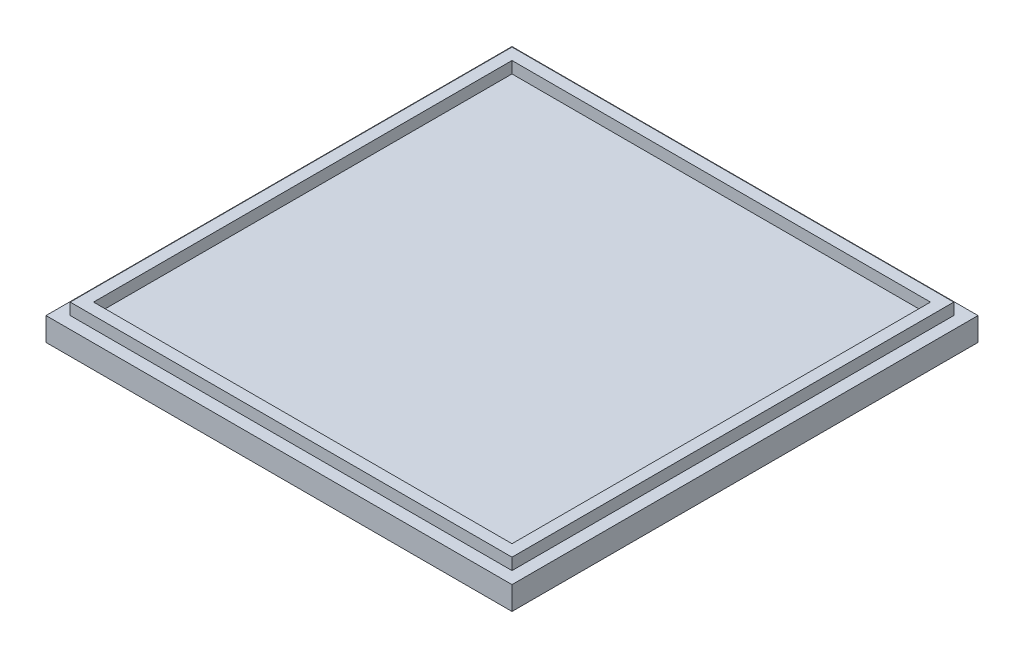
ISO-10303-21;
HEADER;
FILE_DESCRIPTION(('STEP AP214'),'2;1');
FILE_NAME('part.step','',(''),(''),'','','');
FILE_SCHEMA(('AUTOMOTIVE_DESIGN { 1 0 10303 214 1 1 1 1 }'));
ENDSEC;
DATA;
#1=APPLICATION_CONTEXT('core data for automotive mechanical design processes');
#2=APPLICATION_PROTOCOL_DEFINITION('international standard','automotive_design',2000,#1);
#3=PRODUCT_CONTEXT('',#1,'mechanical');
#4=PRODUCT('Part','Part','',(#3));
#5=PRODUCT_RELATED_PRODUCT_CATEGORY('part','',(#4));
#6=PRODUCT_DEFINITION_FORMATION('','',#4);
#7=PRODUCT_DEFINITION_CONTEXT('part definition',#1,'design');
#8=PRODUCT_DEFINITION('design','',#6,#7);
#9=PRODUCT_DEFINITION_SHAPE('','',#8);
#10=(LENGTH_UNIT() NAMED_UNIT(*) SI_UNIT(.MILLI.,.METRE.));
#11=(NAMED_UNIT(*) PLANE_ANGLE_UNIT() SI_UNIT($,.RADIAN.));
#12=(NAMED_UNIT(*) SI_UNIT($,.STERADIAN.) SOLID_ANGLE_UNIT());
#13=UNCERTAINTY_MEASURE_WITH_UNIT(LENGTH_MEASURE(1.E-05),#10,'distance_accuracy_value','');
#14=(GEOMETRIC_REPRESENTATION_CONTEXT(3) GLOBAL_UNCERTAINTY_ASSIGNED_CONTEXT((#13)) GLOBAL_UNIT_ASSIGNED_CONTEXT((#10,
#11,#12)) REPRESENTATION_CONTEXT('',''));
#15=CARTESIAN_POINT('',(0.,0.,0.));
#16=DIRECTION('',(0.,0.,1.));
#17=DIRECTION('',(1.,0.,0.));
#18=AXIS2_PLACEMENT_3D('',#15,#16,#17);
#19=CARTESIAN_POINT('',(0.,10.,0.));
#20=DIRECTION('',(0.,-1.,0.));
#21=DIRECTION('',(0.,0.,-1.));
#22=AXIS2_PLACEMENT_3D('',#19,#20,#21);
#23=PLANE('',#22);
#24=DIRECTION('',(0.,0.,-1.));
#25=VECTOR('',#24,1.);
#26=CARTESIAN_POINT('',(100.,10.,100.));
#27=LINE('',#26,#25);
#28=CARTESIAN_POINT('',(100.,10.,100.));
#29=VERTEX_POINT('',#28);
#30=CARTESIAN_POINT('',(100.,10.,-100.));
#31=VERTEX_POINT('',#30);
#32=EDGE_CURVE('E196',#29,#31,#27,.T.);
#33=ORIENTED_EDGE('',*,*,#32,.T.);
#34=DIRECTION('',(-1.,0.,0.));
#35=VECTOR('',#34,1.);
#36=CARTESIAN_POINT('',(-100.,10.,-100.));
#37=LINE('',#36,#35);
#38=CARTESIAN_POINT('',(-100.,10.,-100.));
#39=VERTEX_POINT('',#38);
#40=EDGE_CURVE('E199',#31,#39,#37,.T.);
#41=ORIENTED_EDGE('',*,*,#40,.T.);
#42=DIRECTION('',(0.,0.,1.));
#43=VECTOR('',#42,1.);
#44=CARTESIAN_POINT('',(-100.,10.,100.));
#45=LINE('',#44,#43);
#46=CARTESIAN_POINT('',(-100.,10.,100.));
#47=VERTEX_POINT('',#46);
#48=EDGE_CURVE('E202',#39,#47,#45,.T.);
#49=ORIENTED_EDGE('',*,*,#48,.T.);
#50=DIRECTION('',(1.,0.,0.));
#51=VECTOR('',#50,1.);
#52=CARTESIAN_POINT('',(-100.,10.,100.));
#53=LINE('',#52,#51);
#54=EDGE_CURVE('E204',#47,#29,#53,.T.);
#55=ORIENTED_EDGE('',*,*,#54,.T.);
#56=EDGE_LOOP('',(#33,#41,#49,#55));
#57=FACE_BOUND('',#56,.T.);
#58=DIRECTION('',(0.,0.,1.));
#59=VECTOR('',#58,1.);
#60=CARTESIAN_POINT('',(-94.8,10.,-94.8));
#61=LINE('',#60,#59);
#62=CARTESIAN_POINT('',(-94.8,10.,-94.8));
#63=VERTEX_POINT('',#62);
#64=CARTESIAN_POINT('',(-94.8,10.,94.8));
#65=VERTEX_POINT('',#64);
#66=EDGE_CURVE('E144',#63,#65,#61,.T.);
#67=ORIENTED_EDGE('',*,*,#66,.F.);
#68=DIRECTION('',(-1.,0.,0.));
#69=VECTOR('',#68,1.);
#70=CARTESIAN_POINT('',(94.8,10.,-94.8));
#71=LINE('',#70,#69);
#72=CARTESIAN_POINT('',(94.8,10.,-94.8));
#73=VERTEX_POINT('',#72);
#74=EDGE_CURVE('E172',#73,#63,#71,.T.);
#75=ORIENTED_EDGE('',*,*,#74,.F.);
#76=DIRECTION('',(0.,0.,-1.));
#77=VECTOR('',#76,1.);
#78=CARTESIAN_POINT('',(94.8,10.,94.8));
#79=LINE('',#78,#77);
#80=CARTESIAN_POINT('',(94.8,10.,94.8));
#81=VERTEX_POINT('',#80);
#82=EDGE_CURVE('E58',#81,#73,#79,.T.);
#83=ORIENTED_EDGE('',*,*,#82,.F.);
#84=DIRECTION('',(1.,0.,0.));
#85=VECTOR('',#84,1.);
#86=CARTESIAN_POINT('',(-94.8,10.,94.8));
#87=LINE('',#86,#85);
#88=EDGE_CURVE('E53',#65,#81,#87,.T.);
#89=ORIENTED_EDGE('',*,*,#88,.F.);
#90=EDGE_LOOP('',(#67,#75,#83,#89));
#91=FACE_BOUND('',#90,.T.);
#92=ADVANCED_FACE('F38',(#57,#91),#23,.F.);
#93=CARTESIAN_POINT('',(100.,10.,100.));
#94=DIRECTION('',(-1.,0.,0.));
#95=DIRECTION('',(0.,0.,1.));
#96=AXIS2_PLACEMENT_3D('',#93,#94,#95);
#97=PLANE('',#96);
#98=DIRECTION('',(0.,0.,-1.));
#99=VECTOR('',#98,1.);
#100=CARTESIAN_POINT('',(100.,0.,100.));
#101=LINE('',#100,#99);
#102=CARTESIAN_POINT('',(100.,0.,100.));
#103=VERTEX_POINT('',#102);
#104=CARTESIAN_POINT('',(100.,0.,-100.));
#105=VERTEX_POINT('',#104);
#106=EDGE_CURVE('E195',#103,#105,#101,.T.);
#107=ORIENTED_EDGE('',*,*,#106,.T.);
#108=DIRECTION('',(0.,-1.,0.));
#109=VECTOR('',#108,1.);
#110=CARTESIAN_POINT('',(100.,10.,-100.));
#111=LINE('',#110,#109);
#112=EDGE_CURVE('E11',#31,#105,#111,.T.);
#113=ORIENTED_EDGE('',*,*,#112,.F.);
#114=ORIENTED_EDGE('',*,*,#32,.F.);
#115=DIRECTION('',(0.,-1.,0.));
#116=VECTOR('',#115,1.);
#117=CARTESIAN_POINT('',(100.,10.,100.));
#118=LINE('',#117,#116);
#119=EDGE_CURVE('E206',#29,#103,#118,.T.);
#120=ORIENTED_EDGE('',*,*,#119,.T.);
#121=EDGE_LOOP('',(#107,#113,#114,#120));
#122=FACE_BOUND('',#121,.T.);
#123=ADVANCED_FACE('F40',(#122),#97,.F.);
#124=CARTESIAN_POINT('',(-100.,10.,-100.));
#125=DIRECTION('',(0.,0.,1.));
#126=DIRECTION('',(1.,0.,0.));
#127=AXIS2_PLACEMENT_3D('',#124,#125,#126);
#128=PLANE('',#127);
#129=DIRECTION('',(-1.,0.,0.));
#130=VECTOR('',#129,1.);
#131=CARTESIAN_POINT('',(-100.,0.,-100.));
#132=LINE('',#131,#130);
#133=CARTESIAN_POINT('',(-100.,0.,-100.));
#134=VERTEX_POINT('',#133);
#135=EDGE_CURVE('E209',#105,#134,#132,.T.);
#136=ORIENTED_EDGE('',*,*,#135,.T.);
#137=DIRECTION('',(0.,-1.,0.));
#138=VECTOR('',#137,1.);
#139=CARTESIAN_POINT('',(-100.,10.,-100.));
#140=LINE('',#139,#138);
#141=EDGE_CURVE('E46',#39,#134,#140,.T.);
#142=ORIENTED_EDGE('',*,*,#141,.F.);
#143=ORIENTED_EDGE('',*,*,#40,.F.);
#144=ORIENTED_EDGE('',*,*,#112,.T.);
#145=EDGE_LOOP('',(#136,#142,#143,#144));
#146=FACE_BOUND('',#145,.T.);
#147=ADVANCED_FACE('F238',(#146),#128,.F.);
#148=CARTESIAN_POINT('',(-100.,10.,100.));
#149=DIRECTION('',(1.,0.,0.));
#150=DIRECTION('',(0.,0.,-1.));
#151=AXIS2_PLACEMENT_3D('',#148,#149,#150);
#152=PLANE('',#151);
#153=DIRECTION('',(0.,0.,1.));
#154=VECTOR('',#153,1.);
#155=CARTESIAN_POINT('',(-100.,0.,100.));
#156=LINE('',#155,#154);
#157=CARTESIAN_POINT('',(-100.,0.,100.));
#158=VERTEX_POINT('',#157);
#159=EDGE_CURVE('E211',#134,#158,#156,.T.);
#160=ORIENTED_EDGE('',*,*,#159,.T.);
#161=DIRECTION('',(0.,-1.,0.));
#162=VECTOR('',#161,1.);
#163=CARTESIAN_POINT('',(-100.,10.,100.));
#164=LINE('',#163,#162);
#165=EDGE_CURVE('E216',#47,#158,#164,.T.);
#166=ORIENTED_EDGE('',*,*,#165,.F.);
#167=ORIENTED_EDGE('',*,*,#48,.F.);
#168=ORIENTED_EDGE('',*,*,#141,.T.);
#169=EDGE_LOOP('',(#160,#166,#167,#168));
#170=FACE_BOUND('',#169,.T.);
#171=ADVANCED_FACE('F223',(#170),#152,.F.);
#172=CARTESIAN_POINT('',(-100.,10.,100.));
#173=DIRECTION('',(0.,0.,-1.));
#174=DIRECTION('',(-1.,0.,0.));
#175=AXIS2_PLACEMENT_3D('',#172,#173,#174);
#176=PLANE('',#175);
#177=DIRECTION('',(1.,0.,0.));
#178=VECTOR('',#177,1.);
#179=CARTESIAN_POINT('',(-100.,0.,100.));
#180=LINE('',#179,#178);
#181=EDGE_CURVE('E200',#158,#103,#180,.T.);
#182=ORIENTED_EDGE('',*,*,#181,.T.);
#183=ORIENTED_EDGE('',*,*,#119,.F.);
#184=ORIENTED_EDGE('',*,*,#54,.F.);
#185=ORIENTED_EDGE('',*,*,#165,.T.);
#186=EDGE_LOOP('',(#182,#183,#184,#185));
#187=FACE_BOUND('',#186,.T.);
#188=ADVANCED_FACE('F232',(#187),#176,.F.);
#189=CARTESIAN_POINT('',(0.,0.,0.));
#190=DIRECTION('',(0.,-1.,0.));
#191=DIRECTION('',(0.,0.,-1.));
#192=AXIS2_PLACEMENT_3D('',#189,#190,#191);
#193=PLANE('',#192);
#194=ORIENTED_EDGE('',*,*,#106,.F.);
#195=ORIENTED_EDGE('',*,*,#181,.F.);
#196=ORIENTED_EDGE('',*,*,#159,.F.);
#197=ORIENTED_EDGE('',*,*,#135,.F.);
#198=EDGE_LOOP('',(#194,#195,#196,#197));
#199=FACE_BOUND('',#198,.T.);
#200=ADVANCED_FACE('F229',(#199),#193,.T.);
#201=CARTESIAN_POINT('',(0.,15.,0.));
#202=DIRECTION('',(0.,1.,0.));
#203=DIRECTION('',(0.,0.,1.));
#204=AXIS2_PLACEMENT_3D('',#201,#202,#203);
#205=PLANE('',#204);
#206=DIRECTION('',(0.,0.,1.));
#207=VECTOR('',#206,1.);
#208=CARTESIAN_POINT('',(-94.8,15.,-94.8));
#209=LINE('',#208,#207);
#210=CARTESIAN_POINT('',(-94.8,15.,-94.8));
#211=VERTEX_POINT('',#210);
#212=CARTESIAN_POINT('',(-94.8,15.,94.8));
#213=VERTEX_POINT('',#212);
#214=EDGE_CURVE('E168',#211,#213,#209,.T.);
#215=ORIENTED_EDGE('',*,*,#214,.T.);
#216=DIRECTION('',(1.,0.,0.));
#217=VECTOR('',#216,1.);
#218=CARTESIAN_POINT('',(-94.8,15.,94.8));
#219=LINE('',#218,#217);
#220=CARTESIAN_POINT('',(94.8,15.,94.8));
#221=VERTEX_POINT('',#220);
#222=EDGE_CURVE('E171',#213,#221,#219,.T.);
#223=ORIENTED_EDGE('',*,*,#222,.T.);
#224=DIRECTION('',(0.,0.,-1.));
#225=VECTOR('',#224,1.);
#226=CARTESIAN_POINT('',(94.8,15.,94.8));
#227=LINE('',#226,#225);
#228=CARTESIAN_POINT('',(94.8,15.,-94.8));
#229=VERTEX_POINT('',#228);
#230=EDGE_CURVE('E174',#221,#229,#227,.T.);
#231=ORIENTED_EDGE('',*,*,#230,.T.);
#232=DIRECTION('',(-1.,0.,0.));
#233=VECTOR('',#232,1.);
#234=CARTESIAN_POINT('',(94.8,15.,-94.8));
#235=LINE('',#234,#233);
#236=EDGE_CURVE('E176',#229,#211,#235,.T.);
#237=ORIENTED_EDGE('',*,*,#236,.T.);
#238=EDGE_LOOP('',(#215,#223,#231,#237));
#239=FACE_BOUND('',#238,.T.);
#240=DIRECTION('',(0.,0.,1.));
#241=VECTOR('',#240,1.);
#242=CARTESIAN_POINT('',(-89.8,15.,-89.8));
#243=LINE('',#242,#241);
#244=CARTESIAN_POINT('',(-89.8,15.,-89.8));
#245=VERTEX_POINT('',#244);
#246=CARTESIAN_POINT('',(-89.8,15.,89.8));
#247=VERTEX_POINT('',#246);
#248=EDGE_CURVE('E136',#245,#247,#243,.T.);
#249=ORIENTED_EDGE('',*,*,#248,.F.);
#250=DIRECTION('',(-1.,0.,0.));
#251=VECTOR('',#250,1.);
#252=CARTESIAN_POINT('',(89.8,15.,-89.8));
#253=LINE('',#252,#251);
#254=CARTESIAN_POINT('',(89.8,15.,-89.8));
#255=VERTEX_POINT('',#254);
#256=EDGE_CURVE('E126',#255,#245,#253,.T.);
#257=ORIENTED_EDGE('',*,*,#256,.F.);
#258=DIRECTION('',(0.,0.,-1.));
#259=VECTOR('',#258,1.);
#260=CARTESIAN_POINT('',(89.8,15.,89.8));
#261=LINE('',#260,#259);
#262=CARTESIAN_POINT('',(89.8,15.,89.8));
#263=VERTEX_POINT('',#262);
#264=EDGE_CURVE('E152',#263,#255,#261,.T.);
#265=ORIENTED_EDGE('',*,*,#264,.F.);
#266=DIRECTION('',(1.,0.,0.));
#267=VECTOR('',#266,1.);
#268=CARTESIAN_POINT('',(-89.8,15.,89.8));
#269=LINE('',#268,#267);
#270=EDGE_CURVE('E150',#247,#263,#269,.T.);
#271=ORIENTED_EDGE('',*,*,#270,.F.);
#272=EDGE_LOOP('',(#249,#257,#265,#271));
#273=FACE_BOUND('',#272,.T.);
#274=ADVANCED_FACE('F148',(#239,#273),#205,.T.);
#275=CARTESIAN_POINT('',(-94.8,15.,-94.8));
#276=DIRECTION('',(1.,0.,0.));
#277=DIRECTION('',(0.,0.,-1.));
#278=AXIS2_PLACEMENT_3D('',#275,#276,#277);
#279=PLANE('',#278);
#280=ORIENTED_EDGE('',*,*,#66,.T.);
#281=DIRECTION('',(0.,-1.,0.));
#282=VECTOR('',#281,1.);
#283=CARTESIAN_POINT('',(-94.8,15.,94.8));
#284=LINE('',#283,#282);
#285=EDGE_CURVE('E193',#213,#65,#284,.T.);
#286=ORIENTED_EDGE('',*,*,#285,.F.);
#287=ORIENTED_EDGE('',*,*,#214,.F.);
#288=DIRECTION('',(0.,-1.,0.));
#289=VECTOR('',#288,1.);
#290=CARTESIAN_POINT('',(-94.8,15.,-94.8));
#291=LINE('',#290,#289);
#292=EDGE_CURVE('E178',#211,#63,#291,.T.);
#293=ORIENTED_EDGE('',*,*,#292,.T.);
#294=EDGE_LOOP('',(#280,#286,#287,#293));
#295=FACE_BOUND('',#294,.T.);
#296=ADVANCED_FACE('F276',(#295),#279,.F.);
#297=CARTESIAN_POINT('',(-94.8,15.,94.8));
#298=DIRECTION('',(0.,0.,-1.));
#299=DIRECTION('',(-1.,0.,0.));
#300=AXIS2_PLACEMENT_3D('',#297,#298,#299);
#301=PLANE('',#300);
#302=ORIENTED_EDGE('',*,*,#88,.T.);
#303=DIRECTION('',(0.,-1.,0.));
#304=VECTOR('',#303,1.);
#305=CARTESIAN_POINT('',(94.8,15.,94.8));
#306=LINE('',#305,#304);
#307=EDGE_CURVE('E190',#221,#81,#306,.T.);
#308=ORIENTED_EDGE('',*,*,#307,.F.);
#309=ORIENTED_EDGE('',*,*,#222,.F.);
#310=ORIENTED_EDGE('',*,*,#285,.T.);
#311=EDGE_LOOP('',(#302,#308,#309,#310));
#312=FACE_BOUND('',#311,.T.);
#313=ADVANCED_FACE('F284',(#312),#301,.F.);
#314=CARTESIAN_POINT('',(94.8,15.,94.8));
#315=DIRECTION('',(-1.,0.,0.));
#316=DIRECTION('',(0.,0.,1.));
#317=AXIS2_PLACEMENT_3D('',#314,#315,#316);
#318=PLANE('',#317);
#319=ORIENTED_EDGE('',*,*,#82,.T.);
#320=DIRECTION('',(0.,-1.,0.));
#321=VECTOR('',#320,1.);
#322=CARTESIAN_POINT('',(94.8,15.,-94.8));
#323=LINE('',#322,#321);
#324=EDGE_CURVE('E187',#229,#73,#323,.T.);
#325=ORIENTED_EDGE('',*,*,#324,.F.);
#326=ORIENTED_EDGE('',*,*,#230,.F.);
#327=ORIENTED_EDGE('',*,*,#307,.T.);
#328=EDGE_LOOP('',(#319,#325,#326,#327));
#329=FACE_BOUND('',#328,.T.);
#330=ADVANCED_FACE('F280',(#329),#318,.F.);
#331=CARTESIAN_POINT('',(94.8,15.,-94.8));
#332=DIRECTION('',(0.,0.,1.));
#333=DIRECTION('',(1.,0.,0.));
#334=AXIS2_PLACEMENT_3D('',#331,#332,#333);
#335=PLANE('',#334);
#336=ORIENTED_EDGE('',*,*,#74,.T.);
#337=ORIENTED_EDGE('',*,*,#292,.F.);
#338=ORIENTED_EDGE('',*,*,#236,.F.);
#339=ORIENTED_EDGE('',*,*,#324,.T.);
#340=EDGE_LOOP('',(#336,#337,#338,#339));
#341=FACE_BOUND('',#340,.T.);
#342=ADVANCED_FACE('F273',(#341),#335,.F.);
#343=CARTESIAN_POINT('',(89.8,15.,-89.8));
#344=DIRECTION('',(0.,0.,1.));
#345=DIRECTION('',(1.,0.,0.));
#346=AXIS2_PLACEMENT_3D('',#343,#344,#345);
#347=PLANE('',#346);
#348=DIRECTION('',(-1.,0.,0.));
#349=VECTOR('',#348,1.);
#350=CARTESIAN_POINT('',(89.8,10.,-89.8));
#351=LINE('',#350,#349);
#352=CARTESIAN_POINT('',(89.8,10.,-89.8));
#353=VERTEX_POINT('',#352);
#354=CARTESIAN_POINT('',(-89.8,10.,-89.8));
#355=VERTEX_POINT('',#354);
#356=EDGE_CURVE('E156',#353,#355,#351,.T.);
#357=ORIENTED_EDGE('',*,*,#356,.F.);
#358=DIRECTION('',(0.,-1.,0.));
#359=VECTOR('',#358,1.);
#360=CARTESIAN_POINT('',(89.8,15.,-89.8));
#361=LINE('',#360,#359);
#362=EDGE_CURVE('E132',#255,#353,#361,.T.);
#363=ORIENTED_EDGE('',*,*,#362,.F.);
#364=ORIENTED_EDGE('',*,*,#256,.T.);
#365=DIRECTION('',(0.,-1.,0.));
#366=VECTOR('',#365,1.);
#367=CARTESIAN_POINT('',(-89.8,15.,-89.8));
#368=LINE('',#367,#366);
#369=EDGE_CURVE('E130',#245,#355,#368,.T.);
#370=ORIENTED_EDGE('',*,*,#369,.T.);
#371=EDGE_LOOP('',(#357,#363,#364,#370));
#372=FACE_BOUND('',#371,.T.);
#373=ADVANCED_FACE('F129',(#372),#347,.T.);
#374=CARTESIAN_POINT('',(-89.8,15.,-89.8));
#375=DIRECTION('',(1.,0.,0.));
#376=DIRECTION('',(0.,0.,-1.));
#377=AXIS2_PLACEMENT_3D('',#374,#375,#376);
#378=PLANE('',#377);
#379=DIRECTION('',(0.,0.,1.));
#380=VECTOR('',#379,1.);
#381=CARTESIAN_POINT('',(-89.8,10.,-89.8));
#382=LINE('',#381,#380);
#383=CARTESIAN_POINT('',(-89.8,10.,89.8));
#384=VERTEX_POINT('',#383);
#385=EDGE_CURVE('E143',#355,#384,#382,.T.);
#386=ORIENTED_EDGE('',*,*,#385,.F.);
#387=ORIENTED_EDGE('',*,*,#369,.F.);
#388=ORIENTED_EDGE('',*,*,#248,.T.);
#389=DIRECTION('',(0.,-1.,0.));
#390=VECTOR('',#389,1.);
#391=CARTESIAN_POINT('',(-89.8,15.,89.8));
#392=LINE('',#391,#390);
#393=EDGE_CURVE('E145',#247,#384,#392,.T.);
#394=ORIENTED_EDGE('',*,*,#393,.T.);
#395=EDGE_LOOP('',(#386,#387,#388,#394));
#396=FACE_BOUND('',#395,.T.);
#397=ADVANCED_FACE('F140',(#396),#378,.T.);
#398=CARTESIAN_POINT('',(-89.8,15.,89.8));
#399=DIRECTION('',(0.,0.,-1.));
#400=DIRECTION('',(-1.,0.,0.));
#401=AXIS2_PLACEMENT_3D('',#398,#399,#400);
#402=PLANE('',#401);
#403=DIRECTION('',(1.,0.,0.));
#404=VECTOR('',#403,1.);
#405=CARTESIAN_POINT('',(-89.8,10.,89.8));
#406=LINE('',#405,#404);
#407=CARTESIAN_POINT('',(89.8,10.,89.8));
#408=VERTEX_POINT('',#407);
#409=EDGE_CURVE('E159',#384,#408,#406,.T.);
#410=ORIENTED_EDGE('',*,*,#409,.F.);
#411=ORIENTED_EDGE('',*,*,#393,.F.);
#412=ORIENTED_EDGE('',*,*,#270,.T.);
#413=DIRECTION('',(0.,-1.,0.));
#414=VECTOR('',#413,1.);
#415=CARTESIAN_POINT('',(89.8,15.,89.8));
#416=LINE('',#415,#414);
#417=EDGE_CURVE('E165',#263,#408,#416,.T.);
#418=ORIENTED_EDGE('',*,*,#417,.T.);
#419=EDGE_LOOP('',(#410,#411,#412,#418));
#420=FACE_BOUND('',#419,.T.);
#421=ADVANCED_FACE('F258',(#420),#402,.T.);
#422=CARTESIAN_POINT('',(89.8,15.,89.8));
#423=DIRECTION('',(-1.,0.,0.));
#424=DIRECTION('',(0.,0.,1.));
#425=AXIS2_PLACEMENT_3D('',#422,#423,#424);
#426=PLANE('',#425);
#427=DIRECTION('',(0.,0.,-1.));
#428=VECTOR('',#427,1.);
#429=CARTESIAN_POINT('',(89.8,10.,89.8));
#430=LINE('',#429,#428);
#431=EDGE_CURVE('E137',#408,#353,#430,.T.);
#432=ORIENTED_EDGE('',*,*,#431,.F.);
#433=ORIENTED_EDGE('',*,*,#417,.F.);
#434=ORIENTED_EDGE('',*,*,#264,.T.);
#435=ORIENTED_EDGE('',*,*,#362,.T.);
#436=EDGE_LOOP('',(#432,#433,#434,#435));
#437=FACE_BOUND('',#436,.T.);
#438=ADVANCED_FACE('F253',(#437),#426,.T.);
#439=ORIENTED_EDGE('',*,*,#431,.T.);
#440=ORIENTED_EDGE('',*,*,#356,.T.);
#441=ORIENTED_EDGE('',*,*,#385,.T.);
#442=ORIENTED_EDGE('',*,*,#409,.T.);
#443=EDGE_LOOP('',(#439,#440,#441,#442));
#444=FACE_BOUND('',#443,.T.);
#445=ADVANCED_FACE('F247',(#444),#23,.F.);
#446=CLOSED_SHELL('',(#92,#123,#147,#171,#188,#200,#274,#296,#313,#330,#342,#373,#397,#421,#438,#445));
#447=MANIFOLD_SOLID_BREP('B2',#446);
#448=ADVANCED_BREP_SHAPE_REPRESENTATION('',(#18,#447),#14);
#449=SHAPE_DEFINITION_REPRESENTATION(#9,#448);
ENDSEC;
END-ISO-10303-21;
